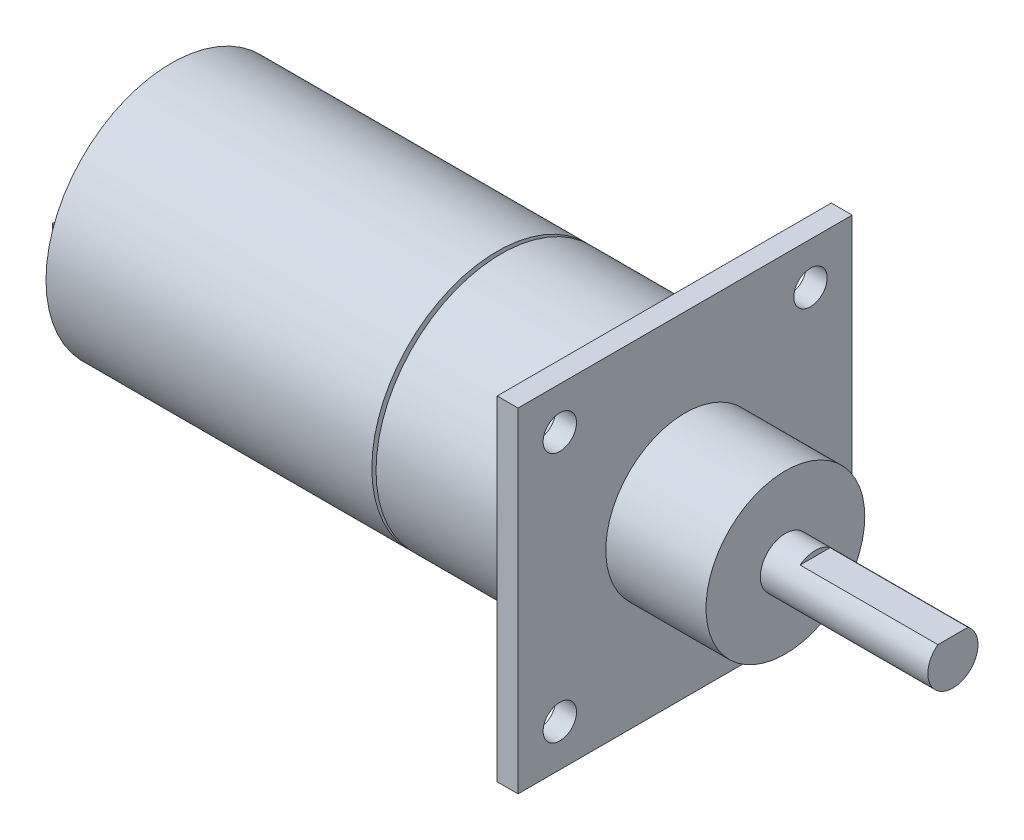
ISO-10303-21;
HEADER;
FILE_DESCRIPTION(('STEP AP214'),'2;1');
FILE_NAME('part.step','',(''),(''),'','','');
FILE_SCHEMA(('AUTOMOTIVE_DESIGN { 1 0 10303 214 1 1 1 1 }'));
ENDSEC;
DATA;
#1=APPLICATION_CONTEXT('core data for automotive mechanical design processes');
#2=APPLICATION_PROTOCOL_DEFINITION('international standard','automotive_design',2000,#1);
#3=PRODUCT_CONTEXT('',#1,'mechanical');
#4=PRODUCT('Part','Part','',(#3));
#5=PRODUCT_RELATED_PRODUCT_CATEGORY('part','',(#4));
#6=PRODUCT_DEFINITION_FORMATION('','',#4);
#7=PRODUCT_DEFINITION_CONTEXT('part definition',#1,'design');
#8=PRODUCT_DEFINITION('design','',#6,#7);
#9=PRODUCT_DEFINITION_SHAPE('','',#8);
#10=(LENGTH_UNIT() NAMED_UNIT(*) SI_UNIT(.MILLI.,.METRE.));
#11=(NAMED_UNIT(*) PLANE_ANGLE_UNIT() SI_UNIT($,.RADIAN.));
#12=(NAMED_UNIT(*) SI_UNIT($,.STERADIAN.) SOLID_ANGLE_UNIT());
#13=UNCERTAINTY_MEASURE_WITH_UNIT(LENGTH_MEASURE(1.E-05),#10,'distance_accuracy_value','');
#14=(GEOMETRIC_REPRESENTATION_CONTEXT(3) GLOBAL_UNCERTAINTY_ASSIGNED_CONTEXT((#13)) GLOBAL_UNIT_ASSIGNED_CONTEXT((#10,
#11,#12)) REPRESENTATION_CONTEXT('',''));
#15=CARTESIAN_POINT('',(0.,0.,0.));
#16=DIRECTION('',(0.,0.,1.));
#17=DIRECTION('',(1.,0.,0.));
#18=AXIS2_PLACEMENT_3D('',#15,#16,#17);
#19=CARTESIAN_POINT('',(-93.5527864045,15.,0.));
#20=DIRECTION('',(-1.,0.,0.));
#21=DIRECTION('',(0.,0.,1.));
#22=AXIS2_PLACEMENT_3D('',#19,#20,#21);
#23=PLANE('',#22);
#24=DIRECTION('',(0.,0.,-1.));
#25=VECTOR('',#24,1.);
#26=CARTESIAN_POINT('',(-93.5527864045,1.5,-10.25));
#27=LINE('',#26,#25);
#28=CARTESIAN_POINT('',(-93.5527864045,1.5,-9.75));
#29=VERTEX_POINT('',#28);
#30=CARTESIAN_POINT('',(-93.5527864045,1.5,-10.25));
#31=VERTEX_POINT('',#30);
#32=EDGE_CURVE('E163',#29,#31,#27,.T.);
#33=ORIENTED_EDGE('',*,*,#32,.F.);
#34=DIRECTION('',(0.,1.,0.));
#35=VECTOR('',#34,1.);
#36=CARTESIAN_POINT('',(-93.5527864045,-1.5,-9.75));
#37=LINE('',#36,#35);
#38=CARTESIAN_POINT('',(-93.5527864045,-1.5,-9.75));
#39=VERTEX_POINT('',#38);
#40=EDGE_CURVE('E160',#39,#29,#37,.T.);
#41=ORIENTED_EDGE('',*,*,#40,.F.);
#42=DIRECTION('',(0.,0.,1.));
#43=VECTOR('',#42,1.);
#44=CARTESIAN_POINT('',(-93.5527864045,-1.5,-10.25));
#45=LINE('',#44,#43);
#46=CARTESIAN_POINT('',(-93.5527864045,-1.5,-10.25));
#47=VERTEX_POINT('',#46);
#48=EDGE_CURVE('E172',#47,#39,#45,.T.);
#49=ORIENTED_EDGE('',*,*,#48,.F.);
#50=DIRECTION('',(0.,-1.,0.));
#51=VECTOR('',#50,1.);
#52=CARTESIAN_POINT('',(-93.5527864045,-1.5,-10.25));
#53=LINE('',#52,#51);
#54=EDGE_CURVE('E180',#31,#47,#53,.T.);
#55=ORIENTED_EDGE('',*,*,#54,.F.);
#56=EDGE_LOOP('',(#33,#41,#49,#55));
#57=FACE_BOUND('',#56,.T.);
#58=CARTESIAN_POINT('',(-93.5527864045,0.,0.));
#59=DIRECTION('',(1.,0.,0.));
#60=DIRECTION('',(0.,0.,-1.));
#61=AXIS2_PLACEMENT_3D('',#58,#59,#60);
#62=CIRCLE('',#61,3.99999999999999);
#63=CARTESIAN_POINT('',(-93.5527864045,0.,-3.99999999999999));
#64=VERTEX_POINT('',#63);
#65=EDGE_CURVE('E267',#64,#64,#62,.T.);
#66=ORIENTED_EDGE('',*,*,#65,.T.);
#67=EDGE_LOOP('',(#66));
#68=FACE_BOUND('',#67,.T.);
#69=CARTESIAN_POINT('',(-93.5527864045,0.,0.));
#70=DIRECTION('',(1.,0.,0.));
#71=DIRECTION('',(0.,0.,-1.));
#72=AXIS2_PLACEMENT_3D('',#69,#70,#71);
#73=CIRCLE('',#72,15.);
#74=CARTESIAN_POINT('',(-93.5527864045,0.,-15.));
#75=VERTEX_POINT('',#74);
#76=EDGE_CURVE('E270',#75,#75,#73,.T.);
#77=ORIENTED_EDGE('',*,*,#76,.F.);
#78=EDGE_LOOP('',(#77));
#79=FACE_BOUND('',#78,.T.);
#80=DIRECTION('',(0.,0.,1.));
#81=VECTOR('',#80,1.);
#82=CARTESIAN_POINT('',(-93.5527864045,-1.50000000000001,10.25));
#83=LINE('',#82,#81);
#84=CARTESIAN_POINT('',(-93.5527864045,-1.50000000000001,9.75));
#85=VERTEX_POINT('',#84);
#86=CARTESIAN_POINT('',(-93.5527864045,-1.50000000000001,10.25));
#87=VERTEX_POINT('',#86);
#88=EDGE_CURVE('E421',#85,#87,#83,.T.);
#89=ORIENTED_EDGE('',*,*,#88,.F.);
#90=DIRECTION('',(0.,-1.,0.));
#91=VECTOR('',#90,1.);
#92=CARTESIAN_POINT('',(-93.5527864045,-1.50000000000001,9.75));
#93=LINE('',#92,#91);
#94=CARTESIAN_POINT('',(-93.5527864045,1.5,9.75));
#95=VERTEX_POINT('',#94);
#96=EDGE_CURVE('E158',#95,#85,#93,.T.);
#97=ORIENTED_EDGE('',*,*,#96,.F.);
#98=DIRECTION('',(0.,0.,-1.));
#99=VECTOR('',#98,1.);
#100=CARTESIAN_POINT('',(-93.5527864045,1.5,10.25));
#101=LINE('',#100,#99);
#102=CARTESIAN_POINT('',(-93.5527864045,1.5,10.25));
#103=VERTEX_POINT('',#102);
#104=EDGE_CURVE('E154',#103,#95,#101,.T.);
#105=ORIENTED_EDGE('',*,*,#104,.F.);
#106=DIRECTION('',(0.,1.,0.));
#107=VECTOR('',#106,1.);
#108=CARTESIAN_POINT('',(-93.5527864045,-1.50000000000001,10.25));
#109=LINE('',#108,#107);
#110=EDGE_CURVE('E423',#87,#103,#109,.T.);
#111=ORIENTED_EDGE('',*,*,#110,.F.);
#112=EDGE_LOOP('',(#89,#97,#105,#111));
#113=FACE_BOUND('',#112,.T.);
#114=ADVANCED_FACE('F33',(#57,#68,#79,#113),#23,.T.);
#115=CARTESIAN_POINT('',(0.,0.,0.));
#116=DIRECTION('',(1.,0.,0.));
#117=DIRECTION('',(0.,0.,-1.));
#118=AXIS2_PLACEMENT_3D('',#115,#116,#117);
#119=CYLINDRICAL_SURFACE('',#118,15.);
#120=CARTESIAN_POINT('',(-34.5527864045,0.,0.));
#121=DIRECTION('',(-1.,0.,0.));
#122=DIRECTION('',(0.,0.,1.));
#123=AXIS2_PLACEMENT_3D('',#120,#121,#122);
#124=CIRCLE('',#123,15.);
#125=CARTESIAN_POINT('',(-34.5527864045,0.,15.));
#126=VERTEX_POINT('',#125);
#127=EDGE_CURVE('E11',#126,#126,#124,.F.);
#128=ORIENTED_EDGE('',*,*,#127,.F.);
#129=EDGE_LOOP('',(#128));
#130=FACE_BOUND('',#129,.T.);
#131=CARTESIAN_POINT('',(-54.0527864045,0.,0.));
#132=DIRECTION('',(1.,0.,0.));
#133=DIRECTION('',(0.,0.,-1.));
#134=AXIS2_PLACEMENT_3D('',#131,#132,#133);
#135=CIRCLE('',#134,15.);
#136=CARTESIAN_POINT('',(-54.0527864045,0.,-15.));
#137=VERTEX_POINT('',#136);
#138=EDGE_CURVE('E282',#137,#137,#135,.T.);
#139=ORIENTED_EDGE('',*,*,#138,.T.);
#140=EDGE_LOOP('',(#139));
#141=FACE_BOUND('',#140,.T.);
#142=ADVANCED_FACE('F321',(#130,#141),#119,.T.);
#143=CARTESIAN_POINT('',(-54.0527864045,15.,0.));
#144=DIRECTION('',(-1.,0.,0.));
#145=DIRECTION('',(0.,0.,1.));
#146=AXIS2_PLACEMENT_3D('',#143,#144,#145);
#147=PLANE('',#146);
#148=CARTESIAN_POINT('',(-54.0527864045,0.,0.));
#149=DIRECTION('',(1.,0.,0.));
#150=DIRECTION('',(0.,0.,-1.));
#151=AXIS2_PLACEMENT_3D('',#148,#149,#150);
#152=CIRCLE('',#151,14.);
#153=CARTESIAN_POINT('',(-54.0527864045,0.,-14.));
#154=VERTEX_POINT('',#153);
#155=EDGE_CURVE('E279',#154,#154,#152,.T.);
#156=ORIENTED_EDGE('',*,*,#155,.T.);
#157=EDGE_LOOP('',(#156));
#158=FACE_BOUND('',#157,.T.);
#159=ORIENTED_EDGE('',*,*,#138,.F.);
#160=EDGE_LOOP('',(#159));
#161=FACE_BOUND('',#160,.T.);
#162=ADVANCED_FACE('F328',(#158,#161),#147,.T.);
#163=CARTESIAN_POINT('',(0.,0.,0.));
#164=DIRECTION('',(1.,0.,0.));
#165=DIRECTION('',(0.,0.,-1.));
#166=AXIS2_PLACEMENT_3D('',#163,#164,#165);
#167=CYLINDRICAL_SURFACE('',#166,14.);
#168=CARTESIAN_POINT('',(-54.5527864045,0.,0.));
#169=DIRECTION('',(1.,0.,0.));
#170=DIRECTION('',(0.,0.,-1.));
#171=AXIS2_PLACEMENT_3D('',#168,#169,#170);
#172=CIRCLE('',#171,14.);
#173=CARTESIAN_POINT('',(-54.5527864045,0.,-14.));
#174=VERTEX_POINT('',#173);
#175=EDGE_CURVE('E276',#174,#174,#172,.T.);
#176=ORIENTED_EDGE('',*,*,#175,.T.);
#177=EDGE_LOOP('',(#176));
#178=FACE_BOUND('',#177,.T.);
#179=ORIENTED_EDGE('',*,*,#155,.F.);
#180=EDGE_LOOP('',(#179));
#181=FACE_BOUND('',#180,.T.);
#182=ADVANCED_FACE('F344',(#178,#181),#167,.T.);
#183=CARTESIAN_POINT('',(-54.5527864045,14.,0.));
#184=DIRECTION('',(1.,0.,0.));
#185=DIRECTION('',(0.,0.,-1.));
#186=AXIS2_PLACEMENT_3D('',#183,#184,#185);
#187=PLANE('',#186);
#188=CARTESIAN_POINT('',(-54.5527864045,0.,0.));
#189=DIRECTION('',(1.,0.,0.));
#190=DIRECTION('',(0.,0.,-1.));
#191=AXIS2_PLACEMENT_3D('',#188,#189,#190);
#192=CIRCLE('',#191,15.);
#193=CARTESIAN_POINT('',(-54.5527864045,0.,-15.));
#194=VERTEX_POINT('',#193);
#195=EDGE_CURVE('E273',#194,#194,#192,.T.);
#196=ORIENTED_EDGE('',*,*,#195,.T.);
#197=EDGE_LOOP('',(#196));
#198=FACE_BOUND('',#197,.T.);
#199=ORIENTED_EDGE('',*,*,#175,.F.);
#200=EDGE_LOOP('',(#199));
#201=FACE_BOUND('',#200,.T.);
#202=ADVANCED_FACE('F340',(#198,#201),#187,.T.);
#203=CARTESIAN_POINT('',(0.,0.,0.));
#204=DIRECTION('',(1.,0.,0.));
#205=DIRECTION('',(0.,0.,-1.));
#206=AXIS2_PLACEMENT_3D('',#203,#204,#205);
#207=CYLINDRICAL_SURFACE('',#206,15.);
#208=ORIENTED_EDGE('',*,*,#76,.T.);
#209=EDGE_LOOP('',(#208));
#210=FACE_BOUND('',#209,.T.);
#211=ORIENTED_EDGE('',*,*,#195,.F.);
#212=EDGE_LOOP('',(#211));
#213=FACE_BOUND('',#212,.T.);
#214=ADVANCED_FACE('F337',(#210,#213),#207,.T.);
#215=CARTESIAN_POINT('',(0.,0.,0.));
#216=DIRECTION('',(1.,0.,0.));
#217=DIRECTION('',(0.,0.,-1.));
#218=AXIS2_PLACEMENT_3D('',#215,#216,#217);
#219=CYLINDRICAL_SURFACE('',#218,3.99999999999999);
#220=CARTESIAN_POINT('',(-96.5527864045,0.,0.));
#221=DIRECTION('',(1.,0.,0.));
#222=DIRECTION('',(0.,0.,-1.));
#223=AXIS2_PLACEMENT_3D('',#220,#221,#222);
#224=CIRCLE('',#223,3.99999999999999);
#225=CARTESIAN_POINT('',(-96.5527864045,0.,-3.99999999999999));
#226=VERTEX_POINT('',#225);
#227=EDGE_CURVE('E264',#226,#226,#224,.T.);
#228=ORIENTED_EDGE('',*,*,#227,.T.);
#229=EDGE_LOOP('',(#228));
#230=FACE_BOUND('',#229,.T.);
#231=ORIENTED_EDGE('',*,*,#65,.F.);
#232=EDGE_LOOP('',(#231));
#233=FACE_BOUND('',#232,.T.);
#234=ADVANCED_FACE('F335',(#230,#233),#219,.T.);
#235=CARTESIAN_POINT('',(-96.5527864045,3.99999999999999,0.));
#236=DIRECTION('',(-1.,0.,0.));
#237=DIRECTION('',(0.,0.,1.));
#238=AXIS2_PLACEMENT_3D('',#235,#236,#237);
#239=PLANE('',#238);
#240=CARTESIAN_POINT('',(-96.5527864045,0.,0.));
#241=DIRECTION('',(1.,0.,0.));
#242=DIRECTION('',(0.,0.,-1.));
#243=AXIS2_PLACEMENT_3D('',#240,#241,#242);
#244=CIRCLE('',#243,0.999999999999989);
#245=CARTESIAN_POINT('',(-96.5527864045,0.,-0.999999999999989));
#246=VERTEX_POINT('',#245);
#247=EDGE_CURVE('E261',#246,#246,#244,.T.);
#248=ORIENTED_EDGE('',*,*,#247,.T.);
#249=EDGE_LOOP('',(#248));
#250=FACE_BOUND('',#249,.T.);
#251=ORIENTED_EDGE('',*,*,#227,.F.);
#252=EDGE_LOOP('',(#251));
#253=FACE_BOUND('',#252,.T.);
#254=ADVANCED_FACE('F404',(#250,#253),#239,.T.);
#255=CARTESIAN_POINT('',(0.,0.,0.));
#256=DIRECTION('',(1.,0.,0.));
#257=DIRECTION('',(0.,0.,-1.));
#258=AXIS2_PLACEMENT_3D('',#255,#256,#257);
#259=CYLINDRICAL_SURFACE('',#258,0.999999999999989);
#260=CARTESIAN_POINT('',(-98.5527864045001,0.,0.));
#261=DIRECTION('',(1.,0.,0.));
#262=DIRECTION('',(0.,0.,-1.));
#263=AXIS2_PLACEMENT_3D('',#260,#261,#262);
#264=CIRCLE('',#263,0.999999999999989);
#265=CARTESIAN_POINT('',(-98.5527864045001,0.,-0.999999999999989));
#266=VERTEX_POINT('',#265);
#267=EDGE_CURVE('E253',#266,#266,#264,.T.);
#268=ORIENTED_EDGE('',*,*,#267,.T.);
#269=EDGE_LOOP('',(#268));
#270=FACE_BOUND('',#269,.T.);
#271=ORIENTED_EDGE('',*,*,#247,.F.);
#272=EDGE_LOOP('',(#271));
#273=FACE_BOUND('',#272,.T.);
#274=ADVANCED_FACE('F401',(#270,#273),#259,.T.);
#275=CARTESIAN_POINT('',(-98.5527864045001,0.999999999999989,0.));
#276=DIRECTION('',(-1.,0.,0.));
#277=DIRECTION('',(0.,0.,1.));
#278=AXIS2_PLACEMENT_3D('',#275,#276,#277);
#279=PLANE('',#278);
#280=ORIENTED_EDGE('',*,*,#267,.F.);
#281=EDGE_LOOP('',(#280));
#282=FACE_BOUND('',#281,.T.);
#283=ADVANCED_FACE('F397',(#282),#279,.T.);
#284=CARTESIAN_POINT('',(-34.5527864045,-20.,-20.));
#285=DIRECTION('',(0.,0.,-1.));
#286=DIRECTION('',(-1.,0.,0.));
#287=AXIS2_PLACEMENT_3D('',#284,#285,#286);
#288=PLANE('',#287);
#289=DIRECTION('',(0.,1.,0.));
#290=VECTOR('',#289,1.);
#291=CARTESIAN_POINT('',(-32.0527864045,-20.,-20.));
#292=LINE('',#291,#290);
#293=CARTESIAN_POINT('',(-32.0527864045,-20.,-20.));
#294=VERTEX_POINT('',#293);
#295=CARTESIAN_POINT('',(-32.0527864045,20.,-20.));
#296=VERTEX_POINT('',#295);
#297=EDGE_CURVE('E224',#294,#296,#292,.T.);
#298=ORIENTED_EDGE('',*,*,#297,.F.);
#299=DIRECTION('',(1.,0.,0.));
#300=VECTOR('',#299,1.);
#301=CARTESIAN_POINT('',(-34.5527864045,-20.,-20.));
#302=LINE('',#301,#300);
#303=CARTESIAN_POINT('',(-34.5527864045,-20.,-20.));
#304=VERTEX_POINT('',#303);
#305=EDGE_CURVE('E251',#304,#294,#302,.T.);
#306=ORIENTED_EDGE('',*,*,#305,.F.);
#307=DIRECTION('',(0.,1.,0.));
#308=VECTOR('',#307,1.);
#309=CARTESIAN_POINT('',(-34.5527864045,-20.,-20.));
#310=LINE('',#309,#308);
#311=CARTESIAN_POINT('',(-34.5527864045,20.,-20.));
#312=VERTEX_POINT('',#311);
#313=EDGE_CURVE('E227',#304,#312,#310,.T.);
#314=ORIENTED_EDGE('',*,*,#313,.T.);
#315=DIRECTION('',(1.,0.,0.));
#316=VECTOR('',#315,1.);
#317=CARTESIAN_POINT('',(-34.5527864045,20.,-20.));
#318=LINE('',#317,#316);
#319=EDGE_CURVE('E240',#312,#296,#318,.T.);
#320=ORIENTED_EDGE('',*,*,#319,.T.);
#321=EDGE_LOOP('',(#298,#306,#314,#320));
#322=FACE_BOUND('',#321,.T.);
#323=ADVANCED_FACE('F390',(#322),#288,.T.);
#324=CARTESIAN_POINT('',(-34.5527864045,-20.,20.));
#325=DIRECTION('',(0.,-1.,0.));
#326=DIRECTION('',(0.,0.,-1.));
#327=AXIS2_PLACEMENT_3D('',#324,#325,#326);
#328=PLANE('',#327);
#329=DIRECTION('',(0.,0.,-1.));
#330=VECTOR('',#329,1.);
#331=CARTESIAN_POINT('',(-32.0527864045,-20.,20.));
#332=LINE('',#331,#330);
#333=CARTESIAN_POINT('',(-32.0527864045,-20.,20.));
#334=VERTEX_POINT('',#333);
#335=EDGE_CURVE('E231',#334,#294,#332,.T.);
#336=ORIENTED_EDGE('',*,*,#335,.F.);
#337=DIRECTION('',(1.,0.,0.));
#338=VECTOR('',#337,1.);
#339=CARTESIAN_POINT('',(-34.5527864045,-20.,20.));
#340=LINE('',#339,#338);
#341=CARTESIAN_POINT('',(-34.5527864045,-20.,20.));
#342=VERTEX_POINT('',#341);
#343=EDGE_CURVE('E254',#342,#334,#340,.T.);
#344=ORIENTED_EDGE('',*,*,#343,.F.);
#345=DIRECTION('',(0.,0.,-1.));
#346=VECTOR('',#345,1.);
#347=CARTESIAN_POINT('',(-34.5527864045,-20.,20.));
#348=LINE('',#347,#346);
#349=EDGE_CURVE('E237',#342,#304,#348,.T.);
#350=ORIENTED_EDGE('',*,*,#349,.T.);
#351=ORIENTED_EDGE('',*,*,#305,.T.);
#352=EDGE_LOOP('',(#336,#344,#350,#351));
#353=FACE_BOUND('',#352,.T.);
#354=ADVANCED_FACE('F387',(#353),#328,.T.);
#355=CARTESIAN_POINT('',(-34.5527864045,-20.,20.));
#356=DIRECTION('',(0.,0.,1.));
#357=DIRECTION('',(1.,0.,0.));
#358=AXIS2_PLACEMENT_3D('',#355,#356,#357);
#359=PLANE('',#358);
#360=DIRECTION('',(0.,-1.,0.));
#361=VECTOR('',#360,1.);
#362=CARTESIAN_POINT('',(-32.0527864045,-20.,20.));
#363=LINE('',#362,#361);
#364=CARTESIAN_POINT('',(-32.0527864045,20.,20.));
#365=VERTEX_POINT('',#364);
#366=EDGE_CURVE('E246',#365,#334,#363,.T.);
#367=ORIENTED_EDGE('',*,*,#366,.F.);
#368=DIRECTION('',(1.,0.,0.));
#369=VECTOR('',#368,1.);
#370=CARTESIAN_POINT('',(-34.5527864045,20.,20.));
#371=LINE('',#370,#369);
#372=CARTESIAN_POINT('',(-34.5527864045,20.,20.));
#373=VERTEX_POINT('',#372);
#374=EDGE_CURVE('E256',#373,#365,#371,.T.);
#375=ORIENTED_EDGE('',*,*,#374,.F.);
#376=DIRECTION('',(0.,-1.,0.));
#377=VECTOR('',#376,1.);
#378=CARTESIAN_POINT('',(-34.5527864045,-20.,20.));
#379=LINE('',#378,#377);
#380=EDGE_CURVE('E234',#373,#342,#379,.T.);
#381=ORIENTED_EDGE('',*,*,#380,.T.);
#382=ORIENTED_EDGE('',*,*,#343,.T.);
#383=EDGE_LOOP('',(#367,#375,#381,#382));
#384=FACE_BOUND('',#383,.T.);
#385=ADVANCED_FACE('F380',(#384),#359,.T.);
#386=CARTESIAN_POINT('',(-34.5527864045,20.,20.));
#387=DIRECTION('',(0.,1.,0.));
#388=DIRECTION('',(0.,0.,1.));
#389=AXIS2_PLACEMENT_3D('',#386,#387,#388);
#390=PLANE('',#389);
#391=DIRECTION('',(0.,0.,1.));
#392=VECTOR('',#391,1.);
#393=CARTESIAN_POINT('',(-32.0527864045,20.,20.));
#394=LINE('',#393,#392);
#395=EDGE_CURVE('E243',#296,#365,#394,.T.);
#396=ORIENTED_EDGE('',*,*,#395,.F.);
#397=ORIENTED_EDGE('',*,*,#319,.F.);
#398=DIRECTION('',(0.,0.,1.));
#399=VECTOR('',#398,1.);
#400=CARTESIAN_POINT('',(-34.5527864045,20.,20.));
#401=LINE('',#400,#399);
#402=EDGE_CURVE('E230',#312,#373,#401,.T.);
#403=ORIENTED_EDGE('',*,*,#402,.T.);
#404=ORIENTED_EDGE('',*,*,#374,.T.);
#405=EDGE_LOOP('',(#396,#397,#403,#404));
#406=FACE_BOUND('',#405,.T.);
#407=ADVANCED_FACE('F374',(#406),#390,.T.);
#408=CARTESIAN_POINT('',(-34.5527864045,0.,0.));
#409=DIRECTION('',(-1.,0.,0.));
#410=DIRECTION('',(0.,0.,1.));
#411=AXIS2_PLACEMENT_3D('',#408,#409,#410);
#412=PLANE('',#411);
#413=CARTESIAN_POINT('',(-34.5527864045,-15.,-15.));
#414=DIRECTION('',(1.,0.,0.));
#415=DIRECTION('',(0.,0.,-1.));
#416=AXIS2_PLACEMENT_3D('',#413,#414,#415);
#417=CIRCLE('',#416,2.);
#418=CARTESIAN_POINT('',(-34.5527864045,-15.,-17.));
#419=VERTEX_POINT('',#418);
#420=EDGE_CURVE('E201',#419,#419,#417,.T.);
#421=ORIENTED_EDGE('',*,*,#420,.T.);
#422=EDGE_LOOP('',(#421));
#423=FACE_BOUND('',#422,.T.);
#424=CARTESIAN_POINT('',(-34.5527864045,15.,-15.));
#425=DIRECTION('',(1.,0.,0.));
#426=DIRECTION('',(0.,0.,-1.));
#427=AXIS2_PLACEMENT_3D('',#424,#425,#426);
#428=CIRCLE('',#427,2.);
#429=CARTESIAN_POINT('',(-34.5527864045,15.,-17.));
#430=VERTEX_POINT('',#429);
#431=EDGE_CURVE('E206',#430,#430,#428,.T.);
#432=ORIENTED_EDGE('',*,*,#431,.T.);
#433=EDGE_LOOP('',(#432));
#434=FACE_BOUND('',#433,.T.);
#435=CARTESIAN_POINT('',(-34.5527864045,15.,15.));
#436=DIRECTION('',(1.,0.,0.));
#437=DIRECTION('',(0.,0.,-1.));
#438=AXIS2_PLACEMENT_3D('',#435,#436,#437);
#439=CIRCLE('',#438,2.);
#440=CARTESIAN_POINT('',(-34.5527864045,15.,13.));
#441=VERTEX_POINT('',#440);
#442=EDGE_CURVE('E212',#441,#441,#439,.T.);
#443=ORIENTED_EDGE('',*,*,#442,.T.);
#444=EDGE_LOOP('',(#443));
#445=FACE_BOUND('',#444,.T.);
#446=CARTESIAN_POINT('',(-34.5527864045,-15.,15.));
#447=DIRECTION('',(1.,0.,0.));
#448=DIRECTION('',(0.,0.,-1.));
#449=AXIS2_PLACEMENT_3D('',#446,#447,#448);
#450=CIRCLE('',#449,2.);
#451=CARTESIAN_POINT('',(-34.5527864045,-15.,13.));
#452=VERTEX_POINT('',#451);
#453=EDGE_CURVE('E221',#452,#452,#450,.T.);
#454=ORIENTED_EDGE('',*,*,#453,.T.);
#455=EDGE_LOOP('',(#454));
#456=FACE_BOUND('',#455,.T.);
#457=ORIENTED_EDGE('',*,*,#127,.T.);
#458=EDGE_LOOP('',(#457));
#459=FACE_BOUND('',#458,.T.);
#460=ORIENTED_EDGE('',*,*,#313,.F.);
#461=ORIENTED_EDGE('',*,*,#349,.F.);
#462=ORIENTED_EDGE('',*,*,#380,.F.);
#463=ORIENTED_EDGE('',*,*,#402,.F.);
#464=EDGE_LOOP('',(#460,#461,#462,#463));
#465=FACE_BOUND('',#464,.T.);
#466=ADVANCED_FACE('F369',(#423,#434,#445,#456,#459,#465),#412,.T.);
#467=CARTESIAN_POINT('',(0.,0.,0.));
#468=DIRECTION('',(1.,0.,0.));
#469=DIRECTION('',(0.,0.,-1.));
#470=AXIS2_PLACEMENT_3D('',#467,#468,#469);
#471=PLANE('',#470);
#472=DIRECTION('',(0.,0.,-1.));
#473=VECTOR('',#472,1.);
#474=CARTESIAN_POINT('',(0.,2.4,0.));
#475=LINE('',#474,#473);
#476=CARTESIAN_POINT('',(0.,2.4,1.8));
#477=VERTEX_POINT('',#476);
#478=CARTESIAN_POINT('',(0.,2.4,-1.8));
#479=VERTEX_POINT('',#478);
#480=EDGE_CURVE('E191',#477,#479,#475,.T.);
#481=ORIENTED_EDGE('',*,*,#480,.F.);
#482=CARTESIAN_POINT('',(0.,0.,0.));
#483=DIRECTION('',(1.,0.,0.));
#484=DIRECTION('',(0.,0.,-1.));
#485=AXIS2_PLACEMENT_3D('',#482,#483,#484);
#486=CIRCLE('',#485,3.);
#487=EDGE_CURVE('E41',#477,#479,#486,.T.);
#488=ORIENTED_EDGE('',*,*,#487,.T.);
#489=EDGE_LOOP('',(#481,#488));
#490=FACE_BOUND('',#489,.T.);
#491=ADVANCED_FACE('F35',(#490),#471,.T.);
#492=CARTESIAN_POINT('',(0.,0.,0.));
#493=DIRECTION('',(1.,0.,0.));
#494=DIRECTION('',(0.,0.,-1.));
#495=AXIS2_PLACEMENT_3D('',#492,#493,#494);
#496=CYLINDRICAL_SURFACE('',#495,3.);
#497=DIRECTION('',(1.,0.,0.));
#498=VECTOR('',#497,1.);
#499=CARTESIAN_POINT('',(-16.5,2.4,-1.8));
#500=LINE('',#499,#498);
#501=CARTESIAN_POINT('',(-16.5,2.4,-1.8));
#502=VERTEX_POINT('',#501);
#503=EDGE_CURVE('E198',#502,#479,#500,.T.);
#504=ORIENTED_EDGE('',*,*,#503,.T.);
#505=ORIENTED_EDGE('',*,*,#487,.F.);
#506=DIRECTION('',(1.,0.,0.));
#507=VECTOR('',#506,1.);
#508=CARTESIAN_POINT('',(-16.5,2.4,1.8));
#509=LINE('',#508,#507);
#510=CARTESIAN_POINT('',(-16.5,2.4,1.8));
#511=VERTEX_POINT('',#510);
#512=EDGE_CURVE('E196',#511,#477,#509,.T.);
#513=ORIENTED_EDGE('',*,*,#512,.F.);
#514=CARTESIAN_POINT('',(-16.5,0.,0.));
#515=DIRECTION('',(1.,0.,0.));
#516=DIRECTION('',(0.,0.,-1.));
#517=AXIS2_PLACEMENT_3D('',#514,#515,#516);
#518=CIRCLE('',#517,3.);
#519=EDGE_CURVE('E192',#502,#511,#518,.T.);
#520=ORIENTED_EDGE('',*,*,#519,.F.);
#521=EDGE_LOOP('',(#504,#505,#513,#520));
#522=FACE_BOUND('',#521,.T.);
#523=CARTESIAN_POINT('',(-20.0527864045,0.,0.));
#524=DIRECTION('',(1.,0.,0.));
#525=DIRECTION('',(0.,0.,-1.));
#526=AXIS2_PLACEMENT_3D('',#523,#524,#525);
#527=CIRCLE('',#526,3.);
#528=CARTESIAN_POINT('',(-20.0527864045,0.,-3.));
#529=VERTEX_POINT('',#528);
#530=EDGE_CURVE('E291',#529,#529,#527,.T.);
#531=ORIENTED_EDGE('',*,*,#530,.T.);
#532=EDGE_LOOP('',(#531));
#533=FACE_BOUND('',#532,.T.);
#534=ADVANCED_FACE('F299',(#522,#533),#496,.T.);
#535=CARTESIAN_POINT('',(-20.0527864045,3.,0.));
#536=DIRECTION('',(1.,0.,0.));
#537=DIRECTION('',(0.,0.,-1.));
#538=AXIS2_PLACEMENT_3D('',#535,#536,#537);
#539=PLANE('',#538);
#540=CARTESIAN_POINT('',(-20.0527864045,0.,0.));
#541=DIRECTION('',(1.,0.,0.));
#542=DIRECTION('',(0.,0.,-1.));
#543=AXIS2_PLACEMENT_3D('',#540,#541,#542);
#544=CIRCLE('',#543,9.5);
#545=CARTESIAN_POINT('',(-20.0527864045,0.,-9.5));
#546=VERTEX_POINT('',#545);
#547=EDGE_CURVE('E288',#546,#546,#544,.T.);
#548=ORIENTED_EDGE('',*,*,#547,.T.);
#549=EDGE_LOOP('',(#548));
#550=FACE_BOUND('',#549,.T.);
#551=ORIENTED_EDGE('',*,*,#530,.F.);
#552=EDGE_LOOP('',(#551));
#553=FACE_BOUND('',#552,.T.);
#554=ADVANCED_FACE('F360',(#550,#553),#539,.T.);
#555=CARTESIAN_POINT('',(0.,0.,0.));
#556=DIRECTION('',(1.,0.,0.));
#557=DIRECTION('',(0.,0.,-1.));
#558=AXIS2_PLACEMENT_3D('',#555,#556,#557);
#559=CYLINDRICAL_SURFACE('',#558,9.5);
#560=CARTESIAN_POINT('',(-32.0527864045,0.,0.));
#561=DIRECTION('',(1.,0.,0.));
#562=DIRECTION('',(0.,0.,-1.));
#563=AXIS2_PLACEMENT_3D('',#560,#561,#562);
#564=CIRCLE('',#563,9.49999999999999);
#565=CARTESIAN_POINT('',(-32.0527864045,0.,-9.49999999999999));
#566=VERTEX_POINT('',#565);
#567=EDGE_CURVE('E285',#566,#566,#564,.T.);
#568=ORIENTED_EDGE('',*,*,#567,.T.);
#569=EDGE_LOOP('',(#568));
#570=FACE_BOUND('',#569,.T.);
#571=ORIENTED_EDGE('',*,*,#547,.F.);
#572=EDGE_LOOP('',(#571));
#573=FACE_BOUND('',#572,.T.);
#574=ADVANCED_FACE('F356',(#570,#573),#559,.T.);
#575=CARTESIAN_POINT('',(-32.0527864045,9.49999999999999,0.));
#576=DIRECTION('',(1.,0.,0.));
#577=DIRECTION('',(0.,0.,-1.));
#578=AXIS2_PLACEMENT_3D('',#575,#576,#577);
#579=PLANE('',#578);
#580=CARTESIAN_POINT('',(-32.0527864045,-15.,-15.));
#581=DIRECTION('',(1.,0.,0.));
#582=DIRECTION('',(0.,0.,-1.));
#583=AXIS2_PLACEMENT_3D('',#580,#581,#582);
#584=CIRCLE('',#583,2.);
#585=CARTESIAN_POINT('',(-32.0527864045,-15.,-17.));
#586=VERTEX_POINT('',#585);
#587=EDGE_CURVE('E203',#586,#586,#584,.T.);
#588=ORIENTED_EDGE('',*,*,#587,.F.);
#589=EDGE_LOOP('',(#588));
#590=FACE_BOUND('',#589,.T.);
#591=CARTESIAN_POINT('',(-32.0527864045,15.,-15.));
#592=DIRECTION('',(1.,0.,0.));
#593=DIRECTION('',(0.,0.,-1.));
#594=AXIS2_PLACEMENT_3D('',#591,#592,#593);
#595=CIRCLE('',#594,2.);
#596=CARTESIAN_POINT('',(-32.0527864045,15.,-17.));
#597=VERTEX_POINT('',#596);
#598=EDGE_CURVE('E209',#597,#597,#595,.T.);
#599=ORIENTED_EDGE('',*,*,#598,.F.);
#600=EDGE_LOOP('',(#599));
#601=FACE_BOUND('',#600,.T.);
#602=CARTESIAN_POINT('',(-32.0527864045,15.,15.));
#603=DIRECTION('',(1.,0.,0.));
#604=DIRECTION('',(0.,0.,-1.));
#605=AXIS2_PLACEMENT_3D('',#602,#603,#604);
#606=CIRCLE('',#605,2.);
#607=CARTESIAN_POINT('',(-32.0527864045,15.,13.));
#608=VERTEX_POINT('',#607);
#609=EDGE_CURVE('E215',#608,#608,#606,.T.);
#610=ORIENTED_EDGE('',*,*,#609,.F.);
#611=EDGE_LOOP('',(#610));
#612=FACE_BOUND('',#611,.T.);
#613=CARTESIAN_POINT('',(-32.0527864045,-15.,15.));
#614=DIRECTION('',(1.,0.,0.));
#615=DIRECTION('',(0.,0.,-1.));
#616=AXIS2_PLACEMENT_3D('',#613,#614,#615);
#617=CIRCLE('',#616,2.);
#618=CARTESIAN_POINT('',(-32.0527864045,-15.,13.));
#619=VERTEX_POINT('',#618);
#620=EDGE_CURVE('E218',#619,#619,#617,.T.);
#621=ORIENTED_EDGE('',*,*,#620,.F.);
#622=EDGE_LOOP('',(#621));
#623=FACE_BOUND('',#622,.T.);
#624=ORIENTED_EDGE('',*,*,#567,.F.);
#625=EDGE_LOOP('',(#624));
#626=FACE_BOUND('',#625,.T.);
#627=ORIENTED_EDGE('',*,*,#297,.T.);
#628=ORIENTED_EDGE('',*,*,#395,.T.);
#629=ORIENTED_EDGE('',*,*,#366,.T.);
#630=ORIENTED_EDGE('',*,*,#335,.T.);
#631=EDGE_LOOP('',(#627,#628,#629,#630));
#632=FACE_BOUND('',#631,.T.);
#633=ADVANCED_FACE('F352',(#590,#601,#612,#623,#626,#632),#579,.T.);
#634=CARTESIAN_POINT('',(-34.5527864045,-15.,15.));
#635=DIRECTION('',(1.,0.,0.));
#636=DIRECTION('',(0.,0.,-1.));
#637=AXIS2_PLACEMENT_3D('',#634,#635,#636);
#638=CYLINDRICAL_SURFACE('',#637,2.);
#639=ORIENTED_EDGE('',*,*,#453,.F.);
#640=EDGE_LOOP('',(#639));
#641=FACE_BOUND('',#640,.T.);
#642=ORIENTED_EDGE('',*,*,#620,.T.);
#643=EDGE_LOOP('',(#642));
#644=FACE_BOUND('',#643,.T.);
#645=ADVANCED_FACE('F355',(#641,#644),#638,.F.);
#646=CARTESIAN_POINT('',(-34.5527864045,15.,15.));
#647=DIRECTION('',(1.,0.,0.));
#648=DIRECTION('',(0.,0.,-1.));
#649=AXIS2_PLACEMENT_3D('',#646,#647,#648);
#650=CYLINDRICAL_SURFACE('',#649,2.);
#651=ORIENTED_EDGE('',*,*,#442,.F.);
#652=EDGE_LOOP('',(#651));
#653=FACE_BOUND('',#652,.T.);
#654=ORIENTED_EDGE('',*,*,#609,.T.);
#655=EDGE_LOOP('',(#654));
#656=FACE_BOUND('',#655,.T.);
#657=ADVANCED_FACE('F552',(#653,#656),#650,.F.);
#658=CARTESIAN_POINT('',(-34.5527864045,15.,-15.));
#659=DIRECTION('',(1.,0.,0.));
#660=DIRECTION('',(0.,0.,-1.));
#661=AXIS2_PLACEMENT_3D('',#658,#659,#660);
#662=CYLINDRICAL_SURFACE('',#661,2.);
#663=ORIENTED_EDGE('',*,*,#431,.F.);
#664=EDGE_LOOP('',(#663));
#665=FACE_BOUND('',#664,.T.);
#666=ORIENTED_EDGE('',*,*,#598,.T.);
#667=EDGE_LOOP('',(#666));
#668=FACE_BOUND('',#667,.T.);
#669=ADVANCED_FACE('F543',(#665,#668),#662,.F.);
#670=CARTESIAN_POINT('',(-34.5527864045,-15.,-15.));
#671=DIRECTION('',(1.,0.,0.));
#672=DIRECTION('',(0.,0.,-1.));
#673=AXIS2_PLACEMENT_3D('',#670,#671,#672);
#674=CYLINDRICAL_SURFACE('',#673,2.);
#675=ORIENTED_EDGE('',*,*,#420,.F.);
#676=EDGE_LOOP('',(#675));
#677=FACE_BOUND('',#676,.T.);
#678=ORIENTED_EDGE('',*,*,#587,.T.);
#679=EDGE_LOOP('',(#678));
#680=FACE_BOUND('',#679,.T.);
#681=ADVANCED_FACE('F318',(#677,#680),#674,.F.);
#682=CARTESIAN_POINT('',(-16.5,2.4,0.));
#683=DIRECTION('',(0.,-1.,0.));
#684=DIRECTION('',(0.,0.,-1.));
#685=AXIS2_PLACEMENT_3D('',#682,#683,#684);
#686=PLANE('',#685);
#687=ORIENTED_EDGE('',*,*,#480,.T.);
#688=ORIENTED_EDGE('',*,*,#503,.F.);
#689=DIRECTION('',(0.,0.,-1.));
#690=VECTOR('',#689,1.);
#691=CARTESIAN_POINT('',(-16.5,2.4,0.));
#692=LINE('',#691,#690);
#693=EDGE_CURVE('E194',#511,#502,#692,.T.);
#694=ORIENTED_EDGE('',*,*,#693,.F.);
#695=ORIENTED_EDGE('',*,*,#512,.T.);
#696=EDGE_LOOP('',(#687,#688,#694,#695));
#697=FACE_BOUND('',#696,.T.);
#698=ADVANCED_FACE('F305',(#697),#686,.F.);
#699=CARTESIAN_POINT('',(-16.5,0.,0.));
#700=DIRECTION('',(1.,0.,0.));
#701=DIRECTION('',(0.,0.,-1.));
#702=AXIS2_PLACEMENT_3D('',#699,#700,#701);
#703=PLANE('',#702);
#704=ORIENTED_EDGE('',*,*,#519,.T.);
#705=ORIENTED_EDGE('',*,*,#693,.T.);
#706=EDGE_LOOP('',(#704,#705));
#707=FACE_BOUND('',#706,.T.);
#708=ADVANCED_FACE('F307',(#707),#703,.T.);
#709=CARTESIAN_POINT('',(-97.5527864045,-1.5,-9.75));
#710=DIRECTION('',(0.,0.,-1.));
#711=DIRECTION('',(-1.,0.,0.));
#712=AXIS2_PLACEMENT_3D('',#709,#710,#711);
#713=PLANE('',#712);
#714=ORIENTED_EDGE('',*,*,#40,.T.);
#715=DIRECTION('',(1.,0.,0.));
#716=VECTOR('',#715,1.);
#717=CARTESIAN_POINT('',(-97.5527864045,1.5,-9.75));
#718=LINE('',#717,#716);
#719=CARTESIAN_POINT('',(-97.5527864045,1.5,-9.75));
#720=VERTEX_POINT('',#719);
#721=EDGE_CURVE('E189',#720,#29,#718,.T.);
#722=ORIENTED_EDGE('',*,*,#721,.F.);
#723=DIRECTION('',(0.,1.,0.));
#724=VECTOR('',#723,1.);
#725=CARTESIAN_POINT('',(-97.5527864045,-1.5,-9.75));
#726=LINE('',#725,#724);
#727=CARTESIAN_POINT('',(-97.5527864045,-1.5,-9.75));
#728=VERTEX_POINT('',#727);
#729=EDGE_CURVE('E168',#728,#720,#726,.T.);
#730=ORIENTED_EDGE('',*,*,#729,.F.);
#731=DIRECTION('',(1.,0.,0.));
#732=VECTOR('',#731,1.);
#733=CARTESIAN_POINT('',(-97.5527864045,-1.5,-9.75));
#734=LINE('',#733,#732);
#735=EDGE_CURVE('E177',#728,#39,#734,.T.);
#736=ORIENTED_EDGE('',*,*,#735,.T.);
#737=EDGE_LOOP('',(#714,#722,#730,#736));
#738=FACE_BOUND('',#737,.T.);
#739=ADVANCED_FACE('F309',(#738),#713,.F.);
#740=CARTESIAN_POINT('',(-97.5527864045,1.5,-10.25));
#741=DIRECTION('',(0.,-1.,0.));
#742=DIRECTION('',(0.,0.,-1.));
#743=AXIS2_PLACEMENT_3D('',#740,#741,#742);
#744=PLANE('',#743);
#745=ORIENTED_EDGE('',*,*,#32,.T.);
#746=DIRECTION('',(1.,0.,0.));
#747=VECTOR('',#746,1.);
#748=CARTESIAN_POINT('',(-97.5527864045,1.5,-10.25));
#749=LINE('',#748,#747);
#750=CARTESIAN_POINT('',(-97.5527864045,1.5,-10.25));
#751=VERTEX_POINT('',#750);
#752=EDGE_CURVE('E186',#751,#31,#749,.T.);
#753=ORIENTED_EDGE('',*,*,#752,.F.);
#754=DIRECTION('',(0.,0.,-1.));
#755=VECTOR('',#754,1.);
#756=CARTESIAN_POINT('',(-97.5527864045,1.5,-10.25));
#757=LINE('',#756,#755);
#758=EDGE_CURVE('E171',#720,#751,#757,.T.);
#759=ORIENTED_EDGE('',*,*,#758,.F.);
#760=ORIENTED_EDGE('',*,*,#721,.T.);
#761=EDGE_LOOP('',(#745,#753,#759,#760));
#762=FACE_BOUND('',#761,.T.);
#763=ADVANCED_FACE('F315',(#762),#744,.F.);
#764=CARTESIAN_POINT('',(-97.5527864045,-1.5,-10.25));
#765=DIRECTION('',(0.,0.,1.));
#766=DIRECTION('',(1.,0.,0.));
#767=AXIS2_PLACEMENT_3D('',#764,#765,#766);
#768=PLANE('',#767);
#769=ORIENTED_EDGE('',*,*,#54,.T.);
#770=DIRECTION('',(1.,0.,0.));
#771=VECTOR('',#770,1.);
#772=CARTESIAN_POINT('',(-97.5527864045,-1.5,-10.25));
#773=LINE('',#772,#771);
#774=CARTESIAN_POINT('',(-97.5527864045,-1.5,-10.25));
#775=VERTEX_POINT('',#774);
#776=EDGE_CURVE('E56',#775,#47,#773,.T.);
#777=ORIENTED_EDGE('',*,*,#776,.F.);
#778=DIRECTION('',(0.,-1.,0.));
#779=VECTOR('',#778,1.);
#780=CARTESIAN_POINT('',(-97.5527864045,-1.5,-10.25));
#781=LINE('',#780,#779);
#782=EDGE_CURVE('E174',#751,#775,#781,.T.);
#783=ORIENTED_EDGE('',*,*,#782,.F.);
#784=ORIENTED_EDGE('',*,*,#752,.T.);
#785=EDGE_LOOP('',(#769,#777,#783,#784));
#786=FACE_BOUND('',#785,.T.);
#787=ADVANCED_FACE('F455',(#786),#768,.F.);
#788=CARTESIAN_POINT('',(-97.5527864045,-1.5,-10.25));
#789=DIRECTION('',(0.,1.,0.));
#790=DIRECTION('',(0.,0.,1.));
#791=AXIS2_PLACEMENT_3D('',#788,#789,#790);
#792=PLANE('',#791);
#793=ORIENTED_EDGE('',*,*,#48,.T.);
#794=ORIENTED_EDGE('',*,*,#735,.F.);
#795=DIRECTION('',(0.,0.,1.));
#796=VECTOR('',#795,1.);
#797=CARTESIAN_POINT('',(-97.5527864045,-1.5,-10.25));
#798=LINE('',#797,#796);
#799=EDGE_CURVE('E176',#775,#728,#798,.T.);
#800=ORIENTED_EDGE('',*,*,#799,.F.);
#801=ORIENTED_EDGE('',*,*,#776,.T.);
#802=EDGE_LOOP('',(#793,#794,#800,#801));
#803=FACE_BOUND('',#802,.T.);
#804=ADVANCED_FACE('F451',(#803),#792,.F.);
#805=CARTESIAN_POINT('',(-97.5527864045,0.,0.));
#806=DIRECTION('',(1.,0.,0.));
#807=DIRECTION('',(0.,0.,-1.));
#808=AXIS2_PLACEMENT_3D('',#805,#806,#807);
#809=PLANE('',#808);
#810=ORIENTED_EDGE('',*,*,#729,.T.);
#811=ORIENTED_EDGE('',*,*,#758,.T.);
#812=ORIENTED_EDGE('',*,*,#782,.T.);
#813=ORIENTED_EDGE('',*,*,#799,.T.);
#814=EDGE_LOOP('',(#810,#811,#812,#813));
#815=FACE_BOUND('',#814,.T.);
#816=ADVANCED_FACE('F448',(#815),#809,.F.);
#817=CARTESIAN_POINT('',(-97.5527864045,-1.50000000000001,9.75));
#818=DIRECTION('',(0.,0.,1.));
#819=DIRECTION('',(1.,0.,0.));
#820=AXIS2_PLACEMENT_3D('',#817,#818,#819);
#821=PLANE('',#820);
#822=ORIENTED_EDGE('',*,*,#96,.T.);
#823=DIRECTION('',(1.,0.,0.));
#824=VECTOR('',#823,1.);
#825=CARTESIAN_POINT('',(-97.5527864045,-1.50000000000001,9.75));
#826=LINE('',#825,#824);
#827=CARTESIAN_POINT('',(-97.5527864045,-1.50000000000001,9.75));
#828=VERTEX_POINT('',#827);
#829=EDGE_CURVE('E139',#828,#85,#826,.T.);
#830=ORIENTED_EDGE('',*,*,#829,.F.);
#831=DIRECTION('',(0.,-1.,0.));
#832=VECTOR('',#831,1.);
#833=CARTESIAN_POINT('',(-97.5527864045,-1.50000000000001,9.75));
#834=LINE('',#833,#832);
#835=CARTESIAN_POINT('',(-97.5527864045,1.5,9.75));
#836=VERTEX_POINT('',#835);
#837=EDGE_CURVE('E146',#836,#828,#834,.T.);
#838=ORIENTED_EDGE('',*,*,#837,.F.);
#839=DIRECTION('',(1.,0.,0.));
#840=VECTOR('',#839,1.);
#841=CARTESIAN_POINT('',(-97.5527864045,1.5,9.75));
#842=LINE('',#841,#840);
#843=EDGE_CURVE('E430',#836,#95,#842,.T.);
#844=ORIENTED_EDGE('',*,*,#843,.T.);
#845=EDGE_LOOP('',(#822,#830,#838,#844));
#846=FACE_BOUND('',#845,.T.);
#847=ADVANCED_FACE('F156',(#846),#821,.F.);
#848=CARTESIAN_POINT('',(-97.5527864045,-1.50000000000001,10.25));
#849=DIRECTION('',(0.,1.,0.));
#850=DIRECTION('',(0.,0.,1.));
#851=AXIS2_PLACEMENT_3D('',#848,#849,#850);
#852=PLANE('',#851);
#853=ORIENTED_EDGE('',*,*,#88,.T.);
#854=DIRECTION('',(1.,0.,0.));
#855=VECTOR('',#854,1.);
#856=CARTESIAN_POINT('',(-97.5527864045,-1.50000000000001,10.25));
#857=LINE('',#856,#855);
#858=CARTESIAN_POINT('',(-97.5527864045,-1.50000000000001,10.25));
#859=VERTEX_POINT('',#858);
#860=EDGE_CURVE('E142',#859,#87,#857,.T.);
#861=ORIENTED_EDGE('',*,*,#860,.F.);
#862=DIRECTION('',(0.,0.,1.));
#863=VECTOR('',#862,1.);
#864=CARTESIAN_POINT('',(-97.5527864045,-1.50000000000001,10.25));
#865=LINE('',#864,#863);
#866=EDGE_CURVE('E135',#828,#859,#865,.T.);
#867=ORIENTED_EDGE('',*,*,#866,.F.);
#868=ORIENTED_EDGE('',*,*,#829,.T.);
#869=EDGE_LOOP('',(#853,#861,#867,#868));
#870=FACE_BOUND('',#869,.T.);
#871=ADVANCED_FACE('F137',(#870),#852,.F.);
#872=CARTESIAN_POINT('',(-97.5527864045,-1.50000000000001,10.25));
#873=DIRECTION('',(0.,0.,-1.));
#874=DIRECTION('',(-1.,0.,0.));
#875=AXIS2_PLACEMENT_3D('',#872,#873,#874);
#876=PLANE('',#875);
#877=ORIENTED_EDGE('',*,*,#110,.T.);
#878=DIRECTION('',(1.,0.,0.));
#879=VECTOR('',#878,1.);
#880=CARTESIAN_POINT('',(-97.5527864045,1.5,10.25));
#881=LINE('',#880,#879);
#882=CARTESIAN_POINT('',(-97.5527864045,1.5,10.25));
#883=VERTEX_POINT('',#882);
#884=EDGE_CURVE('E48',#883,#103,#881,.T.);
#885=ORIENTED_EDGE('',*,*,#884,.F.);
#886=DIRECTION('',(0.,1.,0.));
#887=VECTOR('',#886,1.);
#888=CARTESIAN_POINT('',(-97.5527864045,-1.50000000000001,10.25));
#889=LINE('',#888,#887);
#890=EDGE_CURVE('E145',#859,#883,#889,.T.);
#891=ORIENTED_EDGE('',*,*,#890,.F.);
#892=ORIENTED_EDGE('',*,*,#860,.T.);
#893=EDGE_LOOP('',(#877,#885,#891,#892));
#894=FACE_BOUND('',#893,.T.);
#895=ADVANCED_FACE('F433',(#894),#876,.F.);
#896=CARTESIAN_POINT('',(-97.5527864045,1.5,10.25));
#897=DIRECTION('',(0.,-1.,0.));
#898=DIRECTION('',(0.,0.,-1.));
#899=AXIS2_PLACEMENT_3D('',#896,#897,#898);
#900=PLANE('',#899);
#901=ORIENTED_EDGE('',*,*,#104,.T.);
#902=ORIENTED_EDGE('',*,*,#843,.F.);
#903=DIRECTION('',(0.,0.,-1.));
#904=VECTOR('',#903,1.);
#905=CARTESIAN_POINT('',(-97.5527864045,1.5,10.25));
#906=LINE('',#905,#904);
#907=EDGE_CURVE('E150',#883,#836,#906,.T.);
#908=ORIENTED_EDGE('',*,*,#907,.F.);
#909=ORIENTED_EDGE('',*,*,#884,.T.);
#910=EDGE_LOOP('',(#901,#902,#908,#909));
#911=FACE_BOUND('',#910,.T.);
#912=ADVANCED_FACE('F434',(#911),#900,.F.);
#913=CARTESIAN_POINT('',(-97.5527864045,0.,0.));
#914=DIRECTION('',(-1.,0.,0.));
#915=DIRECTION('',(0.,0.,1.));
#916=AXIS2_PLACEMENT_3D('',#913,#914,#915);
#917=PLANE('',#916);
#918=ORIENTED_EDGE('',*,*,#837,.T.);
#919=ORIENTED_EDGE('',*,*,#866,.T.);
#920=ORIENTED_EDGE('',*,*,#890,.T.);
#921=ORIENTED_EDGE('',*,*,#907,.T.);
#922=EDGE_LOOP('',(#918,#919,#920,#921));
#923=FACE_BOUND('',#922,.T.);
#924=ADVANCED_FACE('F149',(#923),#917,.T.);
#925=CLOSED_SHELL('',(#114,#142,#162,#182,#202,#214,#234,#254,#274,#283,#323,#354,#385,#407,
#466,#491,#534,#554,#574,#633,#645,#657,#669,#681,#698,#708,#739,#763,#787,#804,#816,#847,#871,
#895,#912,#924));
#926=MANIFOLD_SOLID_BREP('B2',#925);
#927=ADVANCED_BREP_SHAPE_REPRESENTATION('',(#18,#926),#14);
#928=SHAPE_DEFINITION_REPRESENTATION(#9,#927);
ENDSEC;
END-ISO-10303-21;
